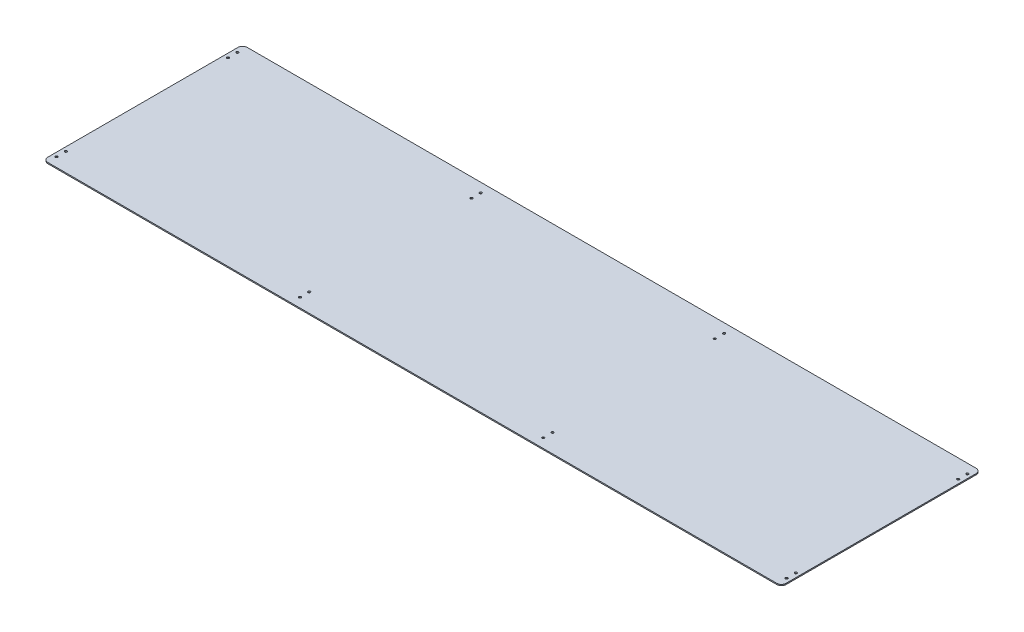
ISO-10303-21;
HEADER;
FILE_DESCRIPTION(('STEP AP214'),'2;1');
FILE_NAME('part.step','',(''),(''),'','','');
FILE_SCHEMA(('AUTOMOTIVE_DESIGN { 1 0 10303 214 1 1 1 1 }'));
ENDSEC;
DATA;
#1=APPLICATION_CONTEXT('core data for automotive mechanical design processes');
#2=APPLICATION_PROTOCOL_DEFINITION('international standard','automotive_design',2000,#1);
#3=PRODUCT_CONTEXT('',#1,'mechanical');
#4=PRODUCT('Part','Part','',(#3));
#5=PRODUCT_RELATED_PRODUCT_CATEGORY('part','',(#4));
#6=PRODUCT_DEFINITION_FORMATION('','',#4);
#7=PRODUCT_DEFINITION_CONTEXT('part definition',#1,'design');
#8=PRODUCT_DEFINITION('design','',#6,#7);
#9=PRODUCT_DEFINITION_SHAPE('','',#8);
#10=(LENGTH_UNIT() NAMED_UNIT(*) SI_UNIT(.MILLI.,.METRE.));
#11=(NAMED_UNIT(*) PLANE_ANGLE_UNIT() SI_UNIT($,.RADIAN.));
#12=(NAMED_UNIT(*) SI_UNIT($,.STERADIAN.) SOLID_ANGLE_UNIT());
#13=UNCERTAINTY_MEASURE_WITH_UNIT(LENGTH_MEASURE(1.E-05),#10,'distance_accuracy_value','');
#14=(GEOMETRIC_REPRESENTATION_CONTEXT(3) GLOBAL_UNCERTAINTY_ASSIGNED_CONTEXT((#13)) GLOBAL_UNIT_ASSIGNED_CONTEXT((#10,
#11,#12)) REPRESENTATION_CONTEXT('',''));
#15=CARTESIAN_POINT('',(0.,0.,0.));
#16=DIRECTION('',(0.,0.,1.));
#17=DIRECTION('',(1.,0.,0.));
#18=AXIS2_PLACEMENT_3D('',#15,#16,#17);
#19=CARTESIAN_POINT('',(2009.775,3.175,-12.7));
#20=DIRECTION('',(0.,1.,0.));
#21=DIRECTION('',(0.,0.,1.));
#22=AXIS2_PLACEMENT_3D('',#19,#20,#21);
#23=PLANE('',#22);
#24=CARTESIAN_POINT('',(2011.3625,3.175,-50.8000000000001));
#25=DIRECTION('',(0.,1.,0.));
#26=DIRECTION('',(0.,0.,1.));
#27=AXIS2_PLACEMENT_3D('',#24,#25,#26);
#28=CIRCLE('',#27,3.17499999999963);
#29=CARTESIAN_POINT('',(2011.3625,3.175,-47.6250000000004));
#30=VERTEX_POINT('',#29);
#31=EDGE_CURVE('E260',#30,#30,#28,.T.);
#32=ORIENTED_EDGE('',*,*,#31,.F.);
#33=EDGE_LOOP('',(#32));
#34=FACE_BOUND('',#33,.T.);
#35=CARTESIAN_POINT('',(2011.3625,3.175,-520.7));
#36=DIRECTION('',(0.,1.,0.));
#37=DIRECTION('',(0.,0.,1.));
#38=AXIS2_PLACEMENT_3D('',#35,#36,#37);
#39=CIRCLE('',#38,3.17499999999962);
#40=CARTESIAN_POINT('',(2011.3625,3.175,-517.525));
#41=VERTEX_POINT('',#40);
#42=EDGE_CURVE('E248',#41,#41,#39,.T.);
#43=ORIENTED_EDGE('',*,*,#42,.F.);
#44=EDGE_LOOP('',(#43));
#45=FACE_BOUND('',#44,.T.);
#46=CARTESIAN_POINT('',(1344.6125,3.175,-50.8000000000001));
#47=DIRECTION('',(0.,1.,0.));
#48=DIRECTION('',(0.,0.,1.));
#49=AXIS2_PLACEMENT_3D('',#46,#47,#48);
#50=CIRCLE('',#49,3.17499999999986);
#51=CARTESIAN_POINT('',(1344.6125,3.175,-47.6250000000002));
#52=VERTEX_POINT('',#51);
#53=EDGE_CURVE('E236',#52,#52,#50,.T.);
#54=ORIENTED_EDGE('',*,*,#53,.F.);
#55=EDGE_LOOP('',(#54));
#56=FACE_BOUND('',#55,.T.);
#57=CARTESIAN_POINT('',(1344.6125,3.175,-520.7));
#58=DIRECTION('',(0.,1.,0.));
#59=DIRECTION('',(0.,0.,1.));
#60=AXIS2_PLACEMENT_3D('',#57,#58,#59);
#61=CIRCLE('',#60,3.17499999999986);
#62=CARTESIAN_POINT('',(1344.6125,3.175,-517.525));
#63=VERTEX_POINT('',#62);
#64=EDGE_CURVE('E224',#63,#63,#61,.T.);
#65=ORIENTED_EDGE('',*,*,#64,.F.);
#66=EDGE_LOOP('',(#65));
#67=FACE_BOUND('',#66,.T.);
#68=CARTESIAN_POINT('',(677.8625,3.175,-50.8000000000001));
#69=DIRECTION('',(0.,1.,0.));
#70=DIRECTION('',(0.,0.,1.));
#71=AXIS2_PLACEMENT_3D('',#68,#69,#70);
#72=CIRCLE('',#71,3.17500000000008);
#73=CARTESIAN_POINT('',(677.8625,3.175,-47.625));
#74=VERTEX_POINT('',#73);
#75=EDGE_CURVE('E212',#74,#74,#72,.T.);
#76=ORIENTED_EDGE('',*,*,#75,.F.);
#77=EDGE_LOOP('',(#76));
#78=FACE_BOUND('',#77,.T.);
#79=CARTESIAN_POINT('',(677.8625,3.175,-520.7));
#80=DIRECTION('',(0.,1.,0.));
#81=DIRECTION('',(0.,0.,1.));
#82=AXIS2_PLACEMENT_3D('',#79,#80,#81);
#83=CIRCLE('',#82,3.17500000000008);
#84=CARTESIAN_POINT('',(677.8625,3.175,-517.525));
#85=VERTEX_POINT('',#84);
#86=EDGE_CURVE('E200',#85,#85,#83,.T.);
#87=ORIENTED_EDGE('',*,*,#86,.F.);
#88=EDGE_LOOP('',(#87));
#89=FACE_BOUND('',#88,.T.);
#90=CARTESIAN_POINT('',(11.1125,3.175,-50.8000000000001));
#91=DIRECTION('',(0.,1.,0.));
#92=DIRECTION('',(0.,0.,1.));
#93=AXIS2_PLACEMENT_3D('',#90,#91,#92);
#94=CIRCLE('',#93,3.175);
#95=CARTESIAN_POINT('',(11.1125,3.175,-47.6250000000001));
#96=VERTEX_POINT('',#95);
#97=EDGE_CURVE('E188',#96,#96,#94,.T.);
#98=ORIENTED_EDGE('',*,*,#97,.F.);
#99=EDGE_LOOP('',(#98));
#100=FACE_BOUND('',#99,.T.);
#101=CARTESIAN_POINT('',(11.1125,3.175,-520.7));
#102=DIRECTION('',(0.,1.,0.));
#103=DIRECTION('',(0.,0.,1.));
#104=AXIS2_PLACEMENT_3D('',#101,#102,#103);
#105=CIRCLE('',#104,3.175);
#106=CARTESIAN_POINT('',(11.1125,3.175,-517.525));
#107=VERTEX_POINT('',#106);
#108=EDGE_CURVE('E134',#107,#107,#105,.T.);
#109=ORIENTED_EDGE('',*,*,#108,.F.);
#110=EDGE_LOOP('',(#109));
#111=FACE_BOUND('',#110,.T.);
#112=CARTESIAN_POINT('',(2009.775,3.175,-12.7));
#113=DIRECTION('',(0.,1.,0.));
#114=DIRECTION('',(0.,0.,1.));
#115=AXIS2_PLACEMENT_3D('',#112,#113,#114);
#116=CIRCLE('',#115,12.7000000000001);
#117=CARTESIAN_POINT('',(2009.775,3.175,0.));
#118=VERTEX_POINT('',#117);
#119=CARTESIAN_POINT('',(2022.475,3.175,-12.7000000000001));
#120=VERTEX_POINT('',#119);
#121=EDGE_CURVE('E145',#118,#120,#116,.T.);
#122=ORIENTED_EDGE('',*,*,#121,.T.);
#123=DIRECTION('',(0.,0.,-1.));
#124=VECTOR('',#123,1.);
#125=CARTESIAN_POINT('',(2022.475,3.175,-12.7000000000001));
#126=LINE('',#125,#124);
#127=CARTESIAN_POINT('',(2022.475,3.175,-533.4));
#128=VERTEX_POINT('',#127);
#129=EDGE_CURVE('E93',#120,#128,#126,.T.);
#130=ORIENTED_EDGE('',*,*,#129,.T.);
#131=CARTESIAN_POINT('',(2009.775,3.175,-533.4));
#132=DIRECTION('',(0.,1.,0.));
#133=DIRECTION('',(0.,0.,-1.));
#134=AXIS2_PLACEMENT_3D('',#131,#132,#133);
#135=CIRCLE('',#134,12.7000000000001);
#136=CARTESIAN_POINT('',(2009.775,3.175,-546.1));
#137=VERTEX_POINT('',#136);
#138=EDGE_CURVE('E160',#128,#137,#135,.T.);
#139=ORIENTED_EDGE('',*,*,#138,.T.);
#140=DIRECTION('',(-1.,0.,0.));
#141=VECTOR('',#140,1.);
#142=CARTESIAN_POINT('',(12.7000000000001,3.175,-546.1));
#143=LINE('',#142,#141);
#144=CARTESIAN_POINT('',(12.7,3.175,-546.1));
#145=VERTEX_POINT('',#144);
#146=EDGE_CURVE('E173',#137,#145,#143,.T.);
#147=ORIENTED_EDGE('',*,*,#146,.T.);
#148=CARTESIAN_POINT('',(12.7,3.175,-533.4));
#149=DIRECTION('',(0.,1.,0.));
#150=DIRECTION('',(0.,0.,-1.));
#151=AXIS2_PLACEMENT_3D('',#148,#149,#150);
#152=CIRCLE('',#151,12.7);
#153=CARTESIAN_POINT('',(0.,3.175,-533.4));
#154=VERTEX_POINT('',#153);
#155=EDGE_CURVE('E112',#145,#154,#152,.T.);
#156=ORIENTED_EDGE('',*,*,#155,.T.);
#157=DIRECTION('',(0.,0.,1.));
#158=VECTOR('',#157,1.);
#159=CARTESIAN_POINT('',(0.,3.175,-12.7000000000001));
#160=LINE('',#159,#158);
#161=CARTESIAN_POINT('',(0.,3.175,-12.7000000000001));
#162=VERTEX_POINT('',#161);
#163=EDGE_CURVE('E106',#154,#162,#160,.T.);
#164=ORIENTED_EDGE('',*,*,#163,.T.);
#165=CARTESIAN_POINT('',(12.7,3.175,-12.7));
#166=DIRECTION('',(0.,1.,0.));
#167=DIRECTION('',(0.,0.,-1.));
#168=AXIS2_PLACEMENT_3D('',#165,#166,#167);
#169=CIRCLE('',#168,12.7);
#170=CARTESIAN_POINT('',(12.7000000000001,3.175,0.));
#171=VERTEX_POINT('',#170);
#172=EDGE_CURVE('E110',#162,#171,#169,.T.);
#173=ORIENTED_EDGE('',*,*,#172,.T.);
#174=DIRECTION('',(1.,0.,0.));
#175=VECTOR('',#174,1.);
#176=CARTESIAN_POINT('',(12.7000000000001,3.175,0.));
#177=LINE('',#176,#175);
#178=EDGE_CURVE('E50',#171,#118,#177,.T.);
#179=ORIENTED_EDGE('',*,*,#178,.T.);
#180=EDGE_LOOP('',(#122,#130,#139,#147,#156,#164,#173,#179));
#181=FACE_BOUND('',#180,.T.);
#182=CARTESIAN_POINT('',(11.1125,3.175,-495.3));
#183=DIRECTION('',(0.,1.,0.));
#184=DIRECTION('',(0.,0.,1.));
#185=AXIS2_PLACEMENT_3D('',#182,#183,#184);
#186=CIRCLE('',#185,3.175);
#187=CARTESIAN_POINT('',(11.1125,3.175,-492.125));
#188=VERTEX_POINT('',#187);
#189=EDGE_CURVE('E182',#188,#188,#186,.T.);
#190=ORIENTED_EDGE('',*,*,#189,.F.);
#191=EDGE_LOOP('',(#190));
#192=FACE_BOUND('',#191,.T.);
#193=CARTESIAN_POINT('',(11.1125,3.175,-25.4000000000001));
#194=DIRECTION('',(0.,1.,0.));
#195=DIRECTION('',(0.,0.,1.));
#196=AXIS2_PLACEMENT_3D('',#193,#194,#195);
#197=CIRCLE('',#196,3.175);
#198=CARTESIAN_POINT('',(11.1125,3.175,-22.2250000000001));
#199=VERTEX_POINT('',#198);
#200=EDGE_CURVE('E194',#199,#199,#197,.T.);
#201=ORIENTED_EDGE('',*,*,#200,.F.);
#202=EDGE_LOOP('',(#201));
#203=FACE_BOUND('',#202,.T.);
#204=CARTESIAN_POINT('',(677.8625,3.175,-495.3));
#205=DIRECTION('',(0.,1.,0.));
#206=DIRECTION('',(0.,0.,1.));
#207=AXIS2_PLACEMENT_3D('',#204,#205,#206);
#208=CIRCLE('',#207,3.17500000000008);
#209=CARTESIAN_POINT('',(677.8625,3.175,-492.125));
#210=VERTEX_POINT('',#209);
#211=EDGE_CURVE('E206',#210,#210,#208,.T.);
#212=ORIENTED_EDGE('',*,*,#211,.F.);
#213=EDGE_LOOP('',(#212));
#214=FACE_BOUND('',#213,.T.);
#215=CARTESIAN_POINT('',(677.8625,3.175,-25.4000000000001));
#216=DIRECTION('',(0.,1.,0.));
#217=DIRECTION('',(0.,0.,1.));
#218=AXIS2_PLACEMENT_3D('',#215,#216,#217);
#219=CIRCLE('',#218,3.17500000000008);
#220=CARTESIAN_POINT('',(677.8625,3.175,-22.225));
#221=VERTEX_POINT('',#220);
#222=EDGE_CURVE('E218',#221,#221,#219,.T.);
#223=ORIENTED_EDGE('',*,*,#222,.F.);
#224=EDGE_LOOP('',(#223));
#225=FACE_BOUND('',#224,.T.);
#226=CARTESIAN_POINT('',(1344.6125,3.175,-495.3));
#227=DIRECTION('',(0.,1.,0.));
#228=DIRECTION('',(0.,0.,1.));
#229=AXIS2_PLACEMENT_3D('',#226,#227,#228);
#230=CIRCLE('',#229,3.17499999999986);
#231=CARTESIAN_POINT('',(1344.6125,3.175,-492.125));
#232=VERTEX_POINT('',#231);
#233=EDGE_CURVE('E230',#232,#232,#230,.T.);
#234=ORIENTED_EDGE('',*,*,#233,.F.);
#235=EDGE_LOOP('',(#234));
#236=FACE_BOUND('',#235,.T.);
#237=CARTESIAN_POINT('',(1344.6125,3.175,-25.4000000000001));
#238=DIRECTION('',(0.,1.,0.));
#239=DIRECTION('',(0.,0.,1.));
#240=AXIS2_PLACEMENT_3D('',#237,#238,#239);
#241=CIRCLE('',#240,3.17499999999986);
#242=CARTESIAN_POINT('',(1344.6125,3.175,-22.2250000000002));
#243=VERTEX_POINT('',#242);
#244=EDGE_CURVE('E242',#243,#243,#241,.T.);
#245=ORIENTED_EDGE('',*,*,#244,.F.);
#246=EDGE_LOOP('',(#245));
#247=FACE_BOUND('',#246,.T.);
#248=CARTESIAN_POINT('',(2011.3625,3.175,-495.3));
#249=DIRECTION('',(0.,1.,0.));
#250=DIRECTION('',(0.,0.,1.));
#251=AXIS2_PLACEMENT_3D('',#248,#249,#250);
#252=CIRCLE('',#251,3.17499999999964);
#253=CARTESIAN_POINT('',(2011.3625,3.175,-492.125));
#254=VERTEX_POINT('',#253);
#255=EDGE_CURVE('E254',#254,#254,#252,.T.);
#256=ORIENTED_EDGE('',*,*,#255,.F.);
#257=EDGE_LOOP('',(#256));
#258=FACE_BOUND('',#257,.T.);
#259=CARTESIAN_POINT('',(2011.3625,3.175,-25.4000000000001));
#260=DIRECTION('',(0.,1.,0.));
#261=DIRECTION('',(0.,0.,1.));
#262=AXIS2_PLACEMENT_3D('',#259,#260,#261);
#263=CIRCLE('',#262,3.17499999999963);
#264=CARTESIAN_POINT('',(2011.3625,3.175,-22.2250000000004));
#265=VERTEX_POINT('',#264);
#266=EDGE_CURVE('E266',#265,#265,#263,.T.);
#267=ORIENTED_EDGE('',*,*,#266,.F.);
#268=EDGE_LOOP('',(#267));
#269=FACE_BOUND('',#268,.T.);
#270=ADVANCED_FACE('F33',(#34,#45,#56,#67,#78,#89,#100,#111,#181,#192,#203,#214,#225,#236,#247,
#258,#269),#23,.T.);
#271=CARTESIAN_POINT('',(2009.775,0.,-12.7));
#272=DIRECTION('',(0.,1.,0.));
#273=DIRECTION('',(0.,0.,1.));
#274=AXIS2_PLACEMENT_3D('',#271,#272,#273);
#275=PLANE('',#274);
#276=CARTESIAN_POINT('',(2009.775,0.,-12.7));
#277=DIRECTION('',(0.,1.,0.));
#278=DIRECTION('',(0.,0.,1.));
#279=AXIS2_PLACEMENT_3D('',#276,#277,#278);
#280=CIRCLE('',#279,12.7000000000001);
#281=CARTESIAN_POINT('',(2009.775,0.,0.));
#282=VERTEX_POINT('',#281);
#283=CARTESIAN_POINT('',(2022.475,0.,-12.7000000000001));
#284=VERTEX_POINT('',#283);
#285=EDGE_CURVE('E130',#282,#284,#280,.T.);
#286=ORIENTED_EDGE('',*,*,#285,.F.);
#287=DIRECTION('',(1.,0.,0.));
#288=VECTOR('',#287,1.);
#289=CARTESIAN_POINT('',(12.7000000000001,0.,0.));
#290=LINE('',#289,#288);
#291=CARTESIAN_POINT('',(12.7000000000001,0.,0.));
#292=VERTEX_POINT('',#291);
#293=EDGE_CURVE('E85',#292,#282,#290,.T.);
#294=ORIENTED_EDGE('',*,*,#293,.F.);
#295=CARTESIAN_POINT('',(12.7,0.,-12.7));
#296=DIRECTION('',(0.,1.,0.));
#297=DIRECTION('',(0.,0.,-1.));
#298=AXIS2_PLACEMENT_3D('',#295,#296,#297);
#299=CIRCLE('',#298,12.7);
#300=CARTESIAN_POINT('',(0.,0.,-12.7000000000001));
#301=VERTEX_POINT('',#300);
#302=EDGE_CURVE('E79',#301,#292,#299,.T.);
#303=ORIENTED_EDGE('',*,*,#302,.F.);
#304=DIRECTION('',(0.,0.,1.));
#305=VECTOR('',#304,1.);
#306=CARTESIAN_POINT('',(0.,0.,-12.7000000000001));
#307=LINE('',#306,#305);
#308=CARTESIAN_POINT('',(0.,0.,-533.4));
#309=VERTEX_POINT('',#308);
#310=EDGE_CURVE('E120',#309,#301,#307,.T.);
#311=ORIENTED_EDGE('',*,*,#310,.F.);
#312=CARTESIAN_POINT('',(12.7,0.,-533.4));
#313=DIRECTION('',(0.,1.,0.));
#314=DIRECTION('',(0.,0.,-1.));
#315=AXIS2_PLACEMENT_3D('',#312,#313,#314);
#316=CIRCLE('',#315,12.7);
#317=CARTESIAN_POINT('',(12.7,0.,-546.1));
#318=VERTEX_POINT('',#317);
#319=EDGE_CURVE('E140',#318,#309,#316,.T.);
#320=ORIENTED_EDGE('',*,*,#319,.F.);
#321=DIRECTION('',(-1.,0.,0.));
#322=VECTOR('',#321,1.);
#323=CARTESIAN_POINT('',(12.7000000000001,0.,-546.1));
#324=LINE('',#323,#322);
#325=CARTESIAN_POINT('',(2009.775,0.,-546.1));
#326=VERTEX_POINT('',#325);
#327=EDGE_CURVE('E138',#326,#318,#324,.T.);
#328=ORIENTED_EDGE('',*,*,#327,.F.);
#329=CARTESIAN_POINT('',(2009.775,0.,-533.4));
#330=DIRECTION('',(0.,1.,0.));
#331=DIRECTION('',(0.,0.,-1.));
#332=AXIS2_PLACEMENT_3D('',#329,#330,#331);
#333=CIRCLE('',#332,12.7000000000001);
#334=CARTESIAN_POINT('',(2022.475,0.,-533.4));
#335=VERTEX_POINT('',#334);
#336=EDGE_CURVE('E136',#335,#326,#333,.T.);
#337=ORIENTED_EDGE('',*,*,#336,.F.);
#338=DIRECTION('',(0.,0.,-1.));
#339=VECTOR('',#338,1.);
#340=CARTESIAN_POINT('',(2022.475,0.,-12.7000000000001));
#341=LINE('',#340,#339);
#342=EDGE_CURVE('E133',#284,#335,#341,.T.);
#343=ORIENTED_EDGE('',*,*,#342,.F.);
#344=EDGE_LOOP('',(#286,#294,#303,#311,#320,#328,#337,#343));
#345=FACE_BOUND('',#344,.T.);
#346=CARTESIAN_POINT('',(11.1125,0.,-520.7));
#347=DIRECTION('',(0.,1.,0.));
#348=DIRECTION('',(0.,0.,1.));
#349=AXIS2_PLACEMENT_3D('',#346,#347,#348);
#350=CIRCLE('',#349,3.175);
#351=CARTESIAN_POINT('',(11.1125,0.,-517.525));
#352=VERTEX_POINT('',#351);
#353=EDGE_CURVE('E179',#352,#352,#350,.T.);
#354=ORIENTED_EDGE('',*,*,#353,.T.);
#355=EDGE_LOOP('',(#354));
#356=FACE_BOUND('',#355,.T.);
#357=CARTESIAN_POINT('',(11.1125,0.,-495.3));
#358=DIRECTION('',(0.,1.,0.));
#359=DIRECTION('',(0.,0.,1.));
#360=AXIS2_PLACEMENT_3D('',#357,#358,#359);
#361=CIRCLE('',#360,3.175);
#362=CARTESIAN_POINT('',(11.1125,0.,-492.125));
#363=VERTEX_POINT('',#362);
#364=EDGE_CURVE('E185',#363,#363,#361,.T.);
#365=ORIENTED_EDGE('',*,*,#364,.T.);
#366=EDGE_LOOP('',(#365));
#367=FACE_BOUND('',#366,.T.);
#368=CARTESIAN_POINT('',(11.1125,0.,-50.8000000000001));
#369=DIRECTION('',(0.,1.,0.));
#370=DIRECTION('',(0.,0.,1.));
#371=AXIS2_PLACEMENT_3D('',#368,#369,#370);
#372=CIRCLE('',#371,3.175);
#373=CARTESIAN_POINT('',(11.1125,0.,-47.6250000000001));
#374=VERTEX_POINT('',#373);
#375=EDGE_CURVE('E191',#374,#374,#372,.T.);
#376=ORIENTED_EDGE('',*,*,#375,.T.);
#377=EDGE_LOOP('',(#376));
#378=FACE_BOUND('',#377,.T.);
#379=CARTESIAN_POINT('',(11.1125,0.,-25.4000000000001));
#380=DIRECTION('',(0.,1.,0.));
#381=DIRECTION('',(0.,0.,1.));
#382=AXIS2_PLACEMENT_3D('',#379,#380,#381);
#383=CIRCLE('',#382,3.175);
#384=CARTESIAN_POINT('',(11.1125,0.,-22.2250000000001));
#385=VERTEX_POINT('',#384);
#386=EDGE_CURVE('E197',#385,#385,#383,.T.);
#387=ORIENTED_EDGE('',*,*,#386,.T.);
#388=EDGE_LOOP('',(#387));
#389=FACE_BOUND('',#388,.T.);
#390=CARTESIAN_POINT('',(677.8625,0.,-520.7));
#391=DIRECTION('',(0.,1.,0.));
#392=DIRECTION('',(0.,0.,1.));
#393=AXIS2_PLACEMENT_3D('',#390,#391,#392);
#394=CIRCLE('',#393,3.17500000000008);
#395=CARTESIAN_POINT('',(677.8625,0.,-517.525));
#396=VERTEX_POINT('',#395);
#397=EDGE_CURVE('E203',#396,#396,#394,.T.);
#398=ORIENTED_EDGE('',*,*,#397,.T.);
#399=EDGE_LOOP('',(#398));
#400=FACE_BOUND('',#399,.T.);
#401=CARTESIAN_POINT('',(677.8625,0.,-495.3));
#402=DIRECTION('',(0.,1.,0.));
#403=DIRECTION('',(0.,0.,1.));
#404=AXIS2_PLACEMENT_3D('',#401,#402,#403);
#405=CIRCLE('',#404,3.17500000000008);
#406=CARTESIAN_POINT('',(677.8625,0.,-492.125));
#407=VERTEX_POINT('',#406);
#408=EDGE_CURVE('E209',#407,#407,#405,.T.);
#409=ORIENTED_EDGE('',*,*,#408,.T.);
#410=EDGE_LOOP('',(#409));
#411=FACE_BOUND('',#410,.T.);
#412=CARTESIAN_POINT('',(677.8625,0.,-50.8000000000001));
#413=DIRECTION('',(0.,1.,0.));
#414=DIRECTION('',(0.,0.,1.));
#415=AXIS2_PLACEMENT_3D('',#412,#413,#414);
#416=CIRCLE('',#415,3.17500000000008);
#417=CARTESIAN_POINT('',(677.8625,0.,-47.625));
#418=VERTEX_POINT('',#417);
#419=EDGE_CURVE('E215',#418,#418,#416,.T.);
#420=ORIENTED_EDGE('',*,*,#419,.T.);
#421=EDGE_LOOP('',(#420));
#422=FACE_BOUND('',#421,.T.);
#423=CARTESIAN_POINT('',(677.8625,0.,-25.4000000000001));
#424=DIRECTION('',(0.,1.,0.));
#425=DIRECTION('',(0.,0.,1.));
#426=AXIS2_PLACEMENT_3D('',#423,#424,#425);
#427=CIRCLE('',#426,3.17500000000008);
#428=CARTESIAN_POINT('',(677.8625,0.,-22.225));
#429=VERTEX_POINT('',#428);
#430=EDGE_CURVE('E221',#429,#429,#427,.T.);
#431=ORIENTED_EDGE('',*,*,#430,.T.);
#432=EDGE_LOOP('',(#431));
#433=FACE_BOUND('',#432,.T.);
#434=CARTESIAN_POINT('',(1344.6125,0.,-520.7));
#435=DIRECTION('',(0.,1.,0.));
#436=DIRECTION('',(0.,0.,1.));
#437=AXIS2_PLACEMENT_3D('',#434,#435,#436);
#438=CIRCLE('',#437,3.17499999999986);
#439=CARTESIAN_POINT('',(1344.6125,0.,-517.525));
#440=VERTEX_POINT('',#439);
#441=EDGE_CURVE('E227',#440,#440,#438,.T.);
#442=ORIENTED_EDGE('',*,*,#441,.T.);
#443=EDGE_LOOP('',(#442));
#444=FACE_BOUND('',#443,.T.);
#445=CARTESIAN_POINT('',(1344.6125,0.,-495.3));
#446=DIRECTION('',(0.,1.,0.));
#447=DIRECTION('',(0.,0.,1.));
#448=AXIS2_PLACEMENT_3D('',#445,#446,#447);
#449=CIRCLE('',#448,3.17499999999986);
#450=CARTESIAN_POINT('',(1344.6125,0.,-492.125));
#451=VERTEX_POINT('',#450);
#452=EDGE_CURVE('E233',#451,#451,#449,.T.);
#453=ORIENTED_EDGE('',*,*,#452,.T.);
#454=EDGE_LOOP('',(#453));
#455=FACE_BOUND('',#454,.T.);
#456=CARTESIAN_POINT('',(1344.6125,0.,-50.8000000000001));
#457=DIRECTION('',(0.,1.,0.));
#458=DIRECTION('',(0.,0.,1.));
#459=AXIS2_PLACEMENT_3D('',#456,#457,#458);
#460=CIRCLE('',#459,3.17499999999986);
#461=CARTESIAN_POINT('',(1344.6125,0.,-47.6250000000002));
#462=VERTEX_POINT('',#461);
#463=EDGE_CURVE('E239',#462,#462,#460,.T.);
#464=ORIENTED_EDGE('',*,*,#463,.T.);
#465=EDGE_LOOP('',(#464));
#466=FACE_BOUND('',#465,.T.);
#467=CARTESIAN_POINT('',(1344.6125,0.,-25.4000000000001));
#468=DIRECTION('',(0.,1.,0.));
#469=DIRECTION('',(0.,0.,1.));
#470=AXIS2_PLACEMENT_3D('',#467,#468,#469);
#471=CIRCLE('',#470,3.17499999999986);
#472=CARTESIAN_POINT('',(1344.6125,0.,-22.2250000000002));
#473=VERTEX_POINT('',#472);
#474=EDGE_CURVE('E245',#473,#473,#471,.T.);
#475=ORIENTED_EDGE('',*,*,#474,.T.);
#476=EDGE_LOOP('',(#475));
#477=FACE_BOUND('',#476,.T.);
#478=CARTESIAN_POINT('',(2011.3625,0.,-520.7));
#479=DIRECTION('',(0.,1.,0.));
#480=DIRECTION('',(0.,0.,1.));
#481=AXIS2_PLACEMENT_3D('',#478,#479,#480);
#482=CIRCLE('',#481,3.17499999999962);
#483=CARTESIAN_POINT('',(2011.3625,0.,-517.525));
#484=VERTEX_POINT('',#483);
#485=EDGE_CURVE('E251',#484,#484,#482,.T.);
#486=ORIENTED_EDGE('',*,*,#485,.T.);
#487=EDGE_LOOP('',(#486));
#488=FACE_BOUND('',#487,.T.);
#489=CARTESIAN_POINT('',(2011.3625,0.,-495.3));
#490=DIRECTION('',(0.,1.,0.));
#491=DIRECTION('',(0.,0.,1.));
#492=AXIS2_PLACEMENT_3D('',#489,#490,#491);
#493=CIRCLE('',#492,3.17499999999964);
#494=CARTESIAN_POINT('',(2011.3625,0.,-492.125));
#495=VERTEX_POINT('',#494);
#496=EDGE_CURVE('E257',#495,#495,#493,.T.);
#497=ORIENTED_EDGE('',*,*,#496,.T.);
#498=EDGE_LOOP('',(#497));
#499=FACE_BOUND('',#498,.T.);
#500=CARTESIAN_POINT('',(2011.3625,0.,-50.8000000000001));
#501=DIRECTION('',(0.,1.,0.));
#502=DIRECTION('',(0.,0.,1.));
#503=AXIS2_PLACEMENT_3D('',#500,#501,#502);
#504=CIRCLE('',#503,3.17499999999963);
#505=CARTESIAN_POINT('',(2011.3625,0.,-47.6250000000004));
#506=VERTEX_POINT('',#505);
#507=EDGE_CURVE('E263',#506,#506,#504,.T.);
#508=ORIENTED_EDGE('',*,*,#507,.T.);
#509=EDGE_LOOP('',(#508));
#510=FACE_BOUND('',#509,.T.);
#511=CARTESIAN_POINT('',(2011.3625,0.,-25.4000000000001));
#512=DIRECTION('',(0.,1.,0.));
#513=DIRECTION('',(0.,0.,1.));
#514=AXIS2_PLACEMENT_3D('',#511,#512,#513);
#515=CIRCLE('',#514,3.17499999999963);
#516=CARTESIAN_POINT('',(2011.3625,0.,-22.2250000000004));
#517=VERTEX_POINT('',#516);
#518=EDGE_CURVE('E269',#517,#517,#515,.T.);
#519=ORIENTED_EDGE('',*,*,#518,.T.);
#520=EDGE_LOOP('',(#519));
#521=FACE_BOUND('',#520,.T.);
#522=ADVANCED_FACE('F164',(#345,#356,#367,#378,#389,#400,#411,#422,#433,#444,#455,#466,#477,
#488,#499,#510,#521),#275,.F.);
#523=CARTESIAN_POINT('',(2009.775,3.175,-12.7));
#524=DIRECTION('',(0.,-1.,0.));
#525=DIRECTION('',(0.,0.,-1.));
#526=AXIS2_PLACEMENT_3D('',#523,#524,#525);
#527=CYLINDRICAL_SURFACE('',#526,12.7000000000001);
#528=ORIENTED_EDGE('',*,*,#285,.T.);
#529=DIRECTION('',(0.,-1.,0.));
#530=VECTOR('',#529,1.);
#531=CARTESIAN_POINT('',(2022.475,3.175,-12.7000000000001));
#532=LINE('',#531,#530);
#533=EDGE_CURVE('E11',#120,#284,#532,.T.);
#534=ORIENTED_EDGE('',*,*,#533,.F.);
#535=ORIENTED_EDGE('',*,*,#121,.F.);
#536=DIRECTION('',(0.,-1.,0.));
#537=VECTOR('',#536,1.);
#538=CARTESIAN_POINT('',(2009.775,3.175,0.));
#539=LINE('',#538,#537);
#540=EDGE_CURVE('E126',#118,#282,#539,.T.);
#541=ORIENTED_EDGE('',*,*,#540,.T.);
#542=EDGE_LOOP('',(#528,#534,#535,#541));
#543=FACE_BOUND('',#542,.T.);
#544=ADVANCED_FACE('F35',(#543),#527,.T.);
#545=CARTESIAN_POINT('',(2022.475,3.175,-12.7000000000001));
#546=DIRECTION('',(-1.,0.,0.));
#547=DIRECTION('',(0.,0.,1.));
#548=AXIS2_PLACEMENT_3D('',#545,#546,#547);
#549=PLANE('',#548);
#550=ORIENTED_EDGE('',*,*,#342,.T.);
#551=DIRECTION('',(0.,-1.,0.));
#552=VECTOR('',#551,1.);
#553=CARTESIAN_POINT('',(2022.475,3.175,-533.4));
#554=LINE('',#553,#552);
#555=EDGE_CURVE('E42',#128,#335,#554,.T.);
#556=ORIENTED_EDGE('',*,*,#555,.F.);
#557=ORIENTED_EDGE('',*,*,#129,.F.);
#558=ORIENTED_EDGE('',*,*,#533,.T.);
#559=EDGE_LOOP('',(#550,#556,#557,#558));
#560=FACE_BOUND('',#559,.T.);
#561=ADVANCED_FACE('F303',(#560),#549,.F.);
#562=CARTESIAN_POINT('',(2009.775,3.175,-533.4));
#563=DIRECTION('',(0.,-1.,0.));
#564=DIRECTION('',(0.,0.,-1.));
#565=AXIS2_PLACEMENT_3D('',#562,#563,#564);
#566=CYLINDRICAL_SURFACE('',#565,12.7000000000001);
#567=ORIENTED_EDGE('',*,*,#336,.T.);
#568=DIRECTION('',(0.,-1.,0.));
#569=VECTOR('',#568,1.);
#570=CARTESIAN_POINT('',(2009.775,3.175,-546.1));
#571=LINE('',#570,#569);
#572=EDGE_CURVE('E152',#137,#326,#571,.T.);
#573=ORIENTED_EDGE('',*,*,#572,.F.);
#574=ORIENTED_EDGE('',*,*,#138,.F.);
#575=ORIENTED_EDGE('',*,*,#555,.T.);
#576=EDGE_LOOP('',(#567,#573,#574,#575));
#577=FACE_BOUND('',#576,.T.);
#578=ADVANCED_FACE('F158',(#577),#566,.T.);
#579=CARTESIAN_POINT('',(12.7000000000001,3.175,-546.1));
#580=DIRECTION('',(0.,0.,1.));
#581=DIRECTION('',(1.,0.,0.));
#582=AXIS2_PLACEMENT_3D('',#579,#580,#581);
#583=PLANE('',#582);
#584=ORIENTED_EDGE('',*,*,#327,.T.);
#585=DIRECTION('',(0.,-1.,0.));
#586=VECTOR('',#585,1.);
#587=CARTESIAN_POINT('',(12.7,3.175,-546.1));
#588=LINE('',#587,#586);
#589=EDGE_CURVE('E149',#145,#318,#588,.T.);
#590=ORIENTED_EDGE('',*,*,#589,.F.);
#591=ORIENTED_EDGE('',*,*,#146,.F.);
#592=ORIENTED_EDGE('',*,*,#572,.T.);
#593=EDGE_LOOP('',(#584,#590,#591,#592));
#594=FACE_BOUND('',#593,.T.);
#595=ADVANCED_FACE('F169',(#594),#583,.F.);
#596=CARTESIAN_POINT('',(12.7,3.175,-533.4));
#597=DIRECTION('',(0.,-1.,0.));
#598=DIRECTION('',(0.,0.,-1.));
#599=AXIS2_PLACEMENT_3D('',#596,#597,#598);
#600=CYLINDRICAL_SURFACE('',#599,12.7);
#601=ORIENTED_EDGE('',*,*,#319,.T.);
#602=DIRECTION('',(0.,-1.,0.));
#603=VECTOR('',#602,1.);
#604=CARTESIAN_POINT('',(0.,3.175,-533.4));
#605=LINE('',#604,#603);
#606=EDGE_CURVE('E121',#154,#309,#605,.T.);
#607=ORIENTED_EDGE('',*,*,#606,.F.);
#608=ORIENTED_EDGE('',*,*,#155,.F.);
#609=ORIENTED_EDGE('',*,*,#589,.T.);
#610=EDGE_LOOP('',(#601,#607,#608,#609));
#611=FACE_BOUND('',#610,.T.);
#612=ADVANCED_FACE('F172',(#611),#600,.T.);
#613=CARTESIAN_POINT('',(0.,3.175,-12.7000000000001));
#614=DIRECTION('',(1.,0.,0.));
#615=DIRECTION('',(0.,0.,-1.));
#616=AXIS2_PLACEMENT_3D('',#613,#614,#615);
#617=PLANE('',#616);
#618=ORIENTED_EDGE('',*,*,#310,.T.);
#619=DIRECTION('',(0.,-1.,0.));
#620=VECTOR('',#619,1.);
#621=CARTESIAN_POINT('',(0.,3.175,-12.7000000000001));
#622=LINE('',#621,#620);
#623=EDGE_CURVE('E117',#162,#301,#622,.T.);
#624=ORIENTED_EDGE('',*,*,#623,.F.);
#625=ORIENTED_EDGE('',*,*,#163,.F.);
#626=ORIENTED_EDGE('',*,*,#606,.T.);
#627=EDGE_LOOP('',(#618,#624,#625,#626));
#628=FACE_BOUND('',#627,.T.);
#629=ADVANCED_FACE('F118',(#628),#617,.F.);
#630=CARTESIAN_POINT('',(12.7,3.175,-12.7));
#631=DIRECTION('',(0.,-1.,0.));
#632=DIRECTION('',(0.,0.,-1.));
#633=AXIS2_PLACEMENT_3D('',#630,#631,#632);
#634=CYLINDRICAL_SURFACE('',#633,12.7);
#635=ORIENTED_EDGE('',*,*,#302,.T.);
#636=DIRECTION('',(0.,-1.,0.));
#637=VECTOR('',#636,1.);
#638=CARTESIAN_POINT('',(12.7000000000001,3.175,0.));
#639=LINE('',#638,#637);
#640=EDGE_CURVE('E122',#171,#292,#639,.T.);
#641=ORIENTED_EDGE('',*,*,#640,.F.);
#642=ORIENTED_EDGE('',*,*,#172,.F.);
#643=ORIENTED_EDGE('',*,*,#623,.T.);
#644=EDGE_LOOP('',(#635,#641,#642,#643));
#645=FACE_BOUND('',#644,.T.);
#646=ADVANCED_FACE('F124',(#645),#634,.T.);
#647=CARTESIAN_POINT('',(12.7000000000001,3.175,0.));
#648=DIRECTION('',(0.,0.,-1.));
#649=DIRECTION('',(-1.,0.,0.));
#650=AXIS2_PLACEMENT_3D('',#647,#648,#649);
#651=PLANE('',#650);
#652=ORIENTED_EDGE('',*,*,#293,.T.);
#653=ORIENTED_EDGE('',*,*,#540,.F.);
#654=ORIENTED_EDGE('',*,*,#178,.F.);
#655=ORIENTED_EDGE('',*,*,#640,.T.);
#656=EDGE_LOOP('',(#652,#653,#654,#655));
#657=FACE_BOUND('',#656,.T.);
#658=ADVANCED_FACE('F291',(#657),#651,.F.);
#659=CARTESIAN_POINT('',(11.1125,3.175,-520.7));
#660=DIRECTION('',(0.,-1.,0.));
#661=DIRECTION('',(0.,0.,-1.));
#662=AXIS2_PLACEMENT_3D('',#659,#660,#661);
#663=CYLINDRICAL_SURFACE('',#662,3.175);
#664=ORIENTED_EDGE('',*,*,#108,.T.);
#665=EDGE_LOOP('',(#664));
#666=FACE_BOUND('',#665,.T.);
#667=ORIENTED_EDGE('',*,*,#353,.F.);
#668=EDGE_LOOP('',(#667));
#669=FACE_BOUND('',#668,.T.);
#670=ADVANCED_FACE('F288',(#666,#669),#663,.F.);
#671=CARTESIAN_POINT('',(11.1125,3.175,-495.3));
#672=DIRECTION('',(0.,-1.,0.));
#673=DIRECTION('',(0.,0.,-1.));
#674=AXIS2_PLACEMENT_3D('',#671,#672,#673);
#675=CYLINDRICAL_SURFACE('',#674,3.175);
#676=ORIENTED_EDGE('',*,*,#189,.T.);
#677=EDGE_LOOP('',(#676));
#678=FACE_BOUND('',#677,.T.);
#679=ORIENTED_EDGE('',*,*,#364,.F.);
#680=EDGE_LOOP('',(#679));
#681=FACE_BOUND('',#680,.T.);
#682=ADVANCED_FACE('F367',(#678,#681),#675,.F.);
#683=CARTESIAN_POINT('',(11.1125,3.175,-50.8000000000001));
#684=DIRECTION('',(0.,-1.,0.));
#685=DIRECTION('',(0.,0.,-1.));
#686=AXIS2_PLACEMENT_3D('',#683,#684,#685);
#687=CYLINDRICAL_SURFACE('',#686,3.175);
#688=ORIENTED_EDGE('',*,*,#97,.T.);
#689=EDGE_LOOP('',(#688));
#690=FACE_BOUND('',#689,.T.);
#691=ORIENTED_EDGE('',*,*,#375,.F.);
#692=EDGE_LOOP('',(#691));
#693=FACE_BOUND('',#692,.T.);
#694=ADVANCED_FACE('F375',(#690,#693),#687,.F.);
#695=CARTESIAN_POINT('',(11.1125,3.175,-25.4000000000001));
#696=DIRECTION('',(0.,-1.,0.));
#697=DIRECTION('',(0.,0.,-1.));
#698=AXIS2_PLACEMENT_3D('',#695,#696,#697);
#699=CYLINDRICAL_SURFACE('',#698,3.175);
#700=ORIENTED_EDGE('',*,*,#200,.T.);
#701=EDGE_LOOP('',(#700));
#702=FACE_BOUND('',#701,.T.);
#703=ORIENTED_EDGE('',*,*,#386,.F.);
#704=EDGE_LOOP('',(#703));
#705=FACE_BOUND('',#704,.T.);
#706=ADVANCED_FACE('F383',(#702,#705),#699,.F.);
#707=CARTESIAN_POINT('',(677.8625,3.175,-520.7));
#708=DIRECTION('',(0.,-1.,0.));
#709=DIRECTION('',(0.,0.,-1.));
#710=AXIS2_PLACEMENT_3D('',#707,#708,#709);
#711=CYLINDRICAL_SURFACE('',#710,3.17500000000008);
#712=ORIENTED_EDGE('',*,*,#86,.T.);
#713=EDGE_LOOP('',(#712));
#714=FACE_BOUND('',#713,.T.);
#715=ORIENTED_EDGE('',*,*,#397,.F.);
#716=EDGE_LOOP('',(#715));
#717=FACE_BOUND('',#716,.T.);
#718=ADVANCED_FACE('F392',(#714,#717),#711,.F.);
#719=CARTESIAN_POINT('',(677.8625,3.175,-495.3));
#720=DIRECTION('',(0.,-1.,0.));
#721=DIRECTION('',(0.,0.,-1.));
#722=AXIS2_PLACEMENT_3D('',#719,#720,#721);
#723=CYLINDRICAL_SURFACE('',#722,3.17500000000008);
#724=ORIENTED_EDGE('',*,*,#211,.T.);
#725=EDGE_LOOP('',(#724));
#726=FACE_BOUND('',#725,.T.);
#727=ORIENTED_EDGE('',*,*,#408,.F.);
#728=EDGE_LOOP('',(#727));
#729=FACE_BOUND('',#728,.T.);
#730=ADVANCED_FACE('F401',(#726,#729),#723,.F.);
#731=CARTESIAN_POINT('',(677.8625,3.175,-50.8000000000001));
#732=DIRECTION('',(0.,-1.,0.));
#733=DIRECTION('',(0.,0.,-1.));
#734=AXIS2_PLACEMENT_3D('',#731,#732,#733);
#735=CYLINDRICAL_SURFACE('',#734,3.17500000000008);
#736=ORIENTED_EDGE('',*,*,#75,.T.);
#737=EDGE_LOOP('',(#736));
#738=FACE_BOUND('',#737,.T.);
#739=ORIENTED_EDGE('',*,*,#419,.F.);
#740=EDGE_LOOP('',(#739));
#741=FACE_BOUND('',#740,.T.);
#742=ADVANCED_FACE('F410',(#738,#741),#735,.F.);
#743=CARTESIAN_POINT('',(677.8625,3.175,-25.4000000000001));
#744=DIRECTION('',(0.,-1.,0.));
#745=DIRECTION('',(0.,0.,-1.));
#746=AXIS2_PLACEMENT_3D('',#743,#744,#745);
#747=CYLINDRICAL_SURFACE('',#746,3.17500000000008);
#748=ORIENTED_EDGE('',*,*,#222,.T.);
#749=EDGE_LOOP('',(#748));
#750=FACE_BOUND('',#749,.T.);
#751=ORIENTED_EDGE('',*,*,#430,.F.);
#752=EDGE_LOOP('',(#751));
#753=FACE_BOUND('',#752,.T.);
#754=ADVANCED_FACE('F419',(#750,#753),#747,.F.);
#755=CARTESIAN_POINT('',(1344.6125,3.175,-520.7));
#756=DIRECTION('',(0.,-1.,0.));
#757=DIRECTION('',(0.,0.,-1.));
#758=AXIS2_PLACEMENT_3D('',#755,#756,#757);
#759=CYLINDRICAL_SURFACE('',#758,3.17499999999986);
#760=ORIENTED_EDGE('',*,*,#64,.T.);
#761=EDGE_LOOP('',(#760));
#762=FACE_BOUND('',#761,.T.);
#763=ORIENTED_EDGE('',*,*,#441,.F.);
#764=EDGE_LOOP('',(#763));
#765=FACE_BOUND('',#764,.T.);
#766=ADVANCED_FACE('F428',(#762,#765),#759,.F.);
#767=CARTESIAN_POINT('',(1344.6125,3.175,-495.3));
#768=DIRECTION('',(0.,-1.,0.));
#769=DIRECTION('',(0.,0.,-1.));
#770=AXIS2_PLACEMENT_3D('',#767,#768,#769);
#771=CYLINDRICAL_SURFACE('',#770,3.17499999999986);
#772=ORIENTED_EDGE('',*,*,#233,.T.);
#773=EDGE_LOOP('',(#772));
#774=FACE_BOUND('',#773,.T.);
#775=ORIENTED_EDGE('',*,*,#452,.F.);
#776=EDGE_LOOP('',(#775));
#777=FACE_BOUND('',#776,.T.);
#778=ADVANCED_FACE('F437',(#774,#777),#771,.F.);
#779=CARTESIAN_POINT('',(1344.6125,3.175,-50.8000000000001));
#780=DIRECTION('',(0.,-1.,0.));
#781=DIRECTION('',(0.,0.,-1.));
#782=AXIS2_PLACEMENT_3D('',#779,#780,#781);
#783=CYLINDRICAL_SURFACE('',#782,3.17499999999986);
#784=ORIENTED_EDGE('',*,*,#53,.T.);
#785=EDGE_LOOP('',(#784));
#786=FACE_BOUND('',#785,.T.);
#787=ORIENTED_EDGE('',*,*,#463,.F.);
#788=EDGE_LOOP('',(#787));
#789=FACE_BOUND('',#788,.T.);
#790=ADVANCED_FACE('F446',(#786,#789),#783,.F.);
#791=CARTESIAN_POINT('',(1344.6125,3.175,-25.4000000000001));
#792=DIRECTION('',(0.,-1.,0.));
#793=DIRECTION('',(0.,0.,-1.));
#794=AXIS2_PLACEMENT_3D('',#791,#792,#793);
#795=CYLINDRICAL_SURFACE('',#794,3.17499999999986);
#796=ORIENTED_EDGE('',*,*,#244,.T.);
#797=EDGE_LOOP('',(#796));
#798=FACE_BOUND('',#797,.T.);
#799=ORIENTED_EDGE('',*,*,#474,.F.);
#800=EDGE_LOOP('',(#799));
#801=FACE_BOUND('',#800,.T.);
#802=ADVANCED_FACE('F455',(#798,#801),#795,.F.);
#803=CARTESIAN_POINT('',(2011.3625,3.175,-520.7));
#804=DIRECTION('',(0.,-1.,0.));
#805=DIRECTION('',(0.,0.,-1.));
#806=AXIS2_PLACEMENT_3D('',#803,#804,#805);
#807=CYLINDRICAL_SURFACE('',#806,3.17499999999962);
#808=ORIENTED_EDGE('',*,*,#42,.T.);
#809=EDGE_LOOP('',(#808));
#810=FACE_BOUND('',#809,.T.);
#811=ORIENTED_EDGE('',*,*,#485,.F.);
#812=EDGE_LOOP('',(#811));
#813=FACE_BOUND('',#812,.T.);
#814=ADVANCED_FACE('F464',(#810,#813),#807,.F.);
#815=CARTESIAN_POINT('',(2011.3625,3.175,-495.3));
#816=DIRECTION('',(0.,-1.,0.));
#817=DIRECTION('',(0.,0.,-1.));
#818=AXIS2_PLACEMENT_3D('',#815,#816,#817);
#819=CYLINDRICAL_SURFACE('',#818,3.17499999999964);
#820=ORIENTED_EDGE('',*,*,#255,.T.);
#821=EDGE_LOOP('',(#820));
#822=FACE_BOUND('',#821,.T.);
#823=ORIENTED_EDGE('',*,*,#496,.F.);
#824=EDGE_LOOP('',(#823));
#825=FACE_BOUND('',#824,.T.);
#826=ADVANCED_FACE('F473',(#822,#825),#819,.F.);
#827=CARTESIAN_POINT('',(2011.3625,3.175,-50.8000000000001));
#828=DIRECTION('',(0.,-1.,0.));
#829=DIRECTION('',(0.,0.,-1.));
#830=AXIS2_PLACEMENT_3D('',#827,#828,#829);
#831=CYLINDRICAL_SURFACE('',#830,3.17499999999963);
#832=ORIENTED_EDGE('',*,*,#31,.T.);
#833=EDGE_LOOP('',(#832));
#834=FACE_BOUND('',#833,.T.);
#835=ORIENTED_EDGE('',*,*,#507,.F.);
#836=EDGE_LOOP('',(#835));
#837=FACE_BOUND('',#836,.T.);
#838=ADVANCED_FACE('F482',(#834,#837),#831,.F.);
#839=CARTESIAN_POINT('',(2011.3625,3.175,-25.4000000000001));
#840=DIRECTION('',(0.,-1.,0.));
#841=DIRECTION('',(0.,0.,-1.));
#842=AXIS2_PLACEMENT_3D('',#839,#840,#841);
#843=CYLINDRICAL_SURFACE('',#842,3.17499999999963);
#844=ORIENTED_EDGE('',*,*,#266,.T.);
#845=EDGE_LOOP('',(#844));
#846=FACE_BOUND('',#845,.T.);
#847=ORIENTED_EDGE('',*,*,#518,.F.);
#848=EDGE_LOOP('',(#847));
#849=FACE_BOUND('',#848,.T.);
#850=ADVANCED_FACE('F275',(#846,#849),#843,.F.);
#851=CLOSED_SHELL('',(#270,#522,#544,#561,#578,#595,#612,#629,#646,#658,#670,#682,#694,#706,
#718,#730,#742,#754,#766,#778,#790,#802,#814,#826,#838,#850));
#852=MANIFOLD_SOLID_BREP('B2',#851);
#853=ADVANCED_BREP_SHAPE_REPRESENTATION('',(#18,#852),#14);
#854=SHAPE_DEFINITION_REPRESENTATION(#9,#853);
ENDSEC;
END-ISO-10303-21;
